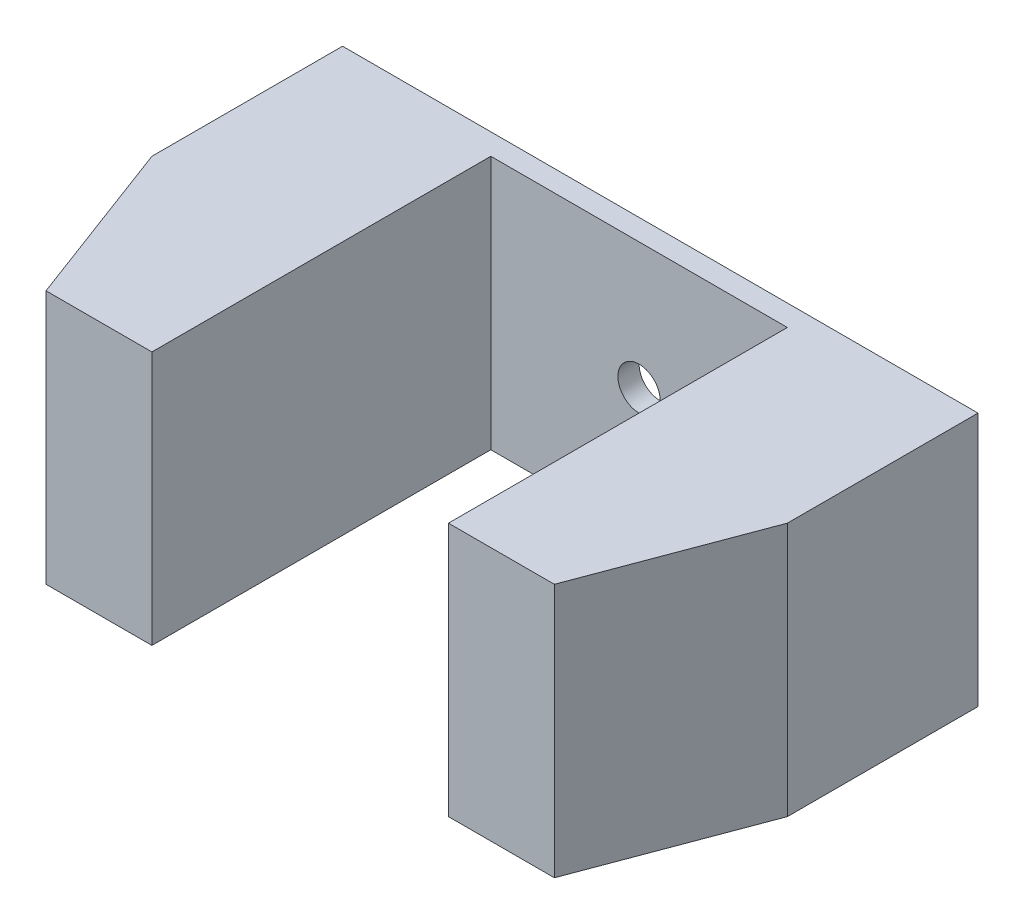
ISO-10303-21;
HEADER;
FILE_DESCRIPTION(('STEP AP214'),'2;1');
FILE_NAME('part.step','',(''),(''),'','','');
FILE_SCHEMA(('AUTOMOTIVE_DESIGN { 1 0 10303 214 1 1 1 1 }'));
ENDSEC;
DATA;
#1=APPLICATION_CONTEXT('core data for automotive mechanical design processes');
#2=APPLICATION_PROTOCOL_DEFINITION('international standard','automotive_design',2000,#1);
#3=PRODUCT_CONTEXT('',#1,'mechanical');
#4=PRODUCT('Part','Part','',(#3));
#5=PRODUCT_RELATED_PRODUCT_CATEGORY('part','',(#4));
#6=PRODUCT_DEFINITION_FORMATION('','',#4);
#7=PRODUCT_DEFINITION_CONTEXT('part definition',#1,'design');
#8=PRODUCT_DEFINITION('design','',#6,#7);
#9=PRODUCT_DEFINITION_SHAPE('','',#8);
#10=(LENGTH_UNIT() NAMED_UNIT(*) SI_UNIT(.MILLI.,.METRE.));
#11=(NAMED_UNIT(*) PLANE_ANGLE_UNIT() SI_UNIT($,.RADIAN.));
#12=(NAMED_UNIT(*) SI_UNIT($,.STERADIAN.) SOLID_ANGLE_UNIT());
#13=UNCERTAINTY_MEASURE_WITH_UNIT(LENGTH_MEASURE(1.E-05),#10,'distance_accuracy_value','');
#14=(GEOMETRIC_REPRESENTATION_CONTEXT(3) GLOBAL_UNCERTAINTY_ASSIGNED_CONTEXT((#13)) GLOBAL_UNIT_ASSIGNED_CONTEXT((#10,
#11,#12)) REPRESENTATION_CONTEXT('',''));
#15=CARTESIAN_POINT('',(0.,0.,0.));
#16=DIRECTION('',(0.,0.,1.));
#17=DIRECTION('',(1.,0.,0.));
#18=AXIS2_PLACEMENT_3D('',#15,#16,#17);
#19=CARTESIAN_POINT('',(0.,0.,5.));
#20=DIRECTION('',(0.,0.,-1.));
#21=DIRECTION('',(-1.,0.,0.));
#22=AXIS2_PLACEMENT_3D('',#19,#20,#21);
#23=PLANE('',#22);
#24=CARTESIAN_POINT('',(0.,0.,5.));
#25=DIRECTION('',(0.,0.,1.));
#26=DIRECTION('',(1.,0.,0.));
#27=AXIS2_PLACEMENT_3D('',#24,#25,#26);
#28=CIRCLE('',#27,5.);
#29=CARTESIAN_POINT('',(5.,0.,5.));
#30=VERTEX_POINT('',#29);
#31=EDGE_CURVE('E191',#30,#30,#28,.T.);
#32=ORIENTED_EDGE('',*,*,#31,.F.);
#33=EDGE_LOOP('',(#32));
#34=FACE_BOUND('',#33,.T.);
#35=DIRECTION('',(0.,1.,0.));
#36=VECTOR('',#35,1.);
#37=CARTESIAN_POINT('',(35.,-119.442719099992,5.));
#38=LINE('',#37,#36);
#39=CARTESIAN_POINT('',(35.,-30.,5.));
#40=VERTEX_POINT('',#39);
#41=CARTESIAN_POINT('',(35.,30.,5.));
#42=VERTEX_POINT('',#41);
#43=EDGE_CURVE('E158',#40,#42,#38,.T.);
#44=ORIENTED_EDGE('',*,*,#43,.T.);
#45=DIRECTION('',(1.,0.,0.));
#46=VECTOR('',#45,1.);
#47=CARTESIAN_POINT('',(-75.,30.,5.));
#48=LINE('',#47,#46);
#49=CARTESIAN_POINT('',(-35.,30.,5.));
#50=VERTEX_POINT('',#49);
#51=EDGE_CURVE('E197',#50,#42,#48,.T.);
#52=ORIENTED_EDGE('',*,*,#51,.F.);
#53=DIRECTION('',(0.,1.,0.));
#54=VECTOR('',#53,1.);
#55=CARTESIAN_POINT('',(-35.,-119.442719099992,5.));
#56=LINE('',#55,#54);
#57=CARTESIAN_POINT('',(-35.,-30.,5.));
#58=VERTEX_POINT('',#57);
#59=EDGE_CURVE('E65',#58,#50,#56,.T.);
#60=ORIENTED_EDGE('',*,*,#59,.F.);
#61=DIRECTION('',(1.,0.,0.));
#62=VECTOR('',#61,1.);
#63=CARTESIAN_POINT('',(-75.,-30.,5.));
#64=LINE('',#63,#62);
#65=EDGE_CURVE('E137',#58,#40,#64,.T.);
#66=ORIENTED_EDGE('',*,*,#65,.T.);
#67=EDGE_LOOP('',(#44,#52,#60,#66));
#68=FACE_BOUND('',#67,.T.);
#69=ADVANCED_FACE('F48',(#34,#68),#23,.F.);
#70=CARTESIAN_POINT('',(0.,0.,0.));
#71=DIRECTION('',(0.,0.,-1.));
#72=DIRECTION('',(-1.,0.,0.));
#73=AXIS2_PLACEMENT_3D('',#70,#71,#72);
#74=PLANE('',#73);
#75=DIRECTION('',(1.,0.,0.));
#76=VECTOR('',#75,1.);
#77=CARTESIAN_POINT('',(-75.,30.,0.));
#78=LINE('',#77,#76);
#79=CARTESIAN_POINT('',(-75.,30.,0.));
#80=VERTEX_POINT('',#79);
#81=CARTESIAN_POINT('',(75.,30.,0.));
#82=VERTEX_POINT('',#81);
#83=EDGE_CURVE('E194',#80,#82,#78,.T.);
#84=ORIENTED_EDGE('',*,*,#83,.T.);
#85=DIRECTION('',(0.,-1.,0.));
#86=VECTOR('',#85,1.);
#87=CARTESIAN_POINT('',(75.,30.,0.));
#88=LINE('',#87,#86);
#89=CARTESIAN_POINT('',(75.,-30.,0.));
#90=VERTEX_POINT('',#89);
#91=EDGE_CURVE('E131',#82,#90,#88,.T.);
#92=ORIENTED_EDGE('',*,*,#91,.T.);
#93=DIRECTION('',(1.,0.,0.));
#94=VECTOR('',#93,1.);
#95=CARTESIAN_POINT('',(-75.,-30.,0.));
#96=LINE('',#95,#94);
#97=CARTESIAN_POINT('',(-75.,-30.,0.));
#98=VERTEX_POINT('',#97);
#99=EDGE_CURVE('E204',#98,#90,#96,.T.);
#100=ORIENTED_EDGE('',*,*,#99,.F.);
#101=DIRECTION('',(0.,-1.,0.));
#102=VECTOR('',#101,1.);
#103=CARTESIAN_POINT('',(-75.,30.,0.));
#104=LINE('',#103,#102);
#105=EDGE_CURVE('E200',#80,#98,#104,.T.);
#106=ORIENTED_EDGE('',*,*,#105,.F.);
#107=EDGE_LOOP('',(#84,#92,#100,#106));
#108=FACE_BOUND('',#107,.T.);
#109=CARTESIAN_POINT('',(0.,0.,0.));
#110=DIRECTION('',(0.,0.,1.));
#111=DIRECTION('',(1.,0.,0.));
#112=AXIS2_PLACEMENT_3D('',#109,#110,#111);
#113=CIRCLE('',#112,5.);
#114=CARTESIAN_POINT('',(5.,0.,0.));
#115=VERTEX_POINT('',#114);
#116=EDGE_CURVE('E174',#115,#115,#113,.T.);
#117=ORIENTED_EDGE('',*,*,#116,.T.);
#118=EDGE_LOOP('',(#117));
#119=FACE_BOUND('',#118,.T.);
#120=ADVANCED_FACE('F213',(#108,#119),#74,.T.);
#121=CARTESIAN_POINT('',(-75.,30.,5.));
#122=DIRECTION('',(0.,1.,0.));
#123=DIRECTION('',(0.,0.,1.));
#124=AXIS2_PLACEMENT_3D('',#121,#122,#123);
#125=PLANE('',#124);
#126=ORIENTED_EDGE('',*,*,#83,.F.);
#127=DIRECTION('',(0.,0.,-1.));
#128=VECTOR('',#127,1.);
#129=CARTESIAN_POINT('',(-75.,30.,5.));
#130=LINE('',#129,#128);
#131=CARTESIAN_POINT('',(-75.,30.,45.));
#132=VERTEX_POINT('',#131);
#133=EDGE_CURVE('E12',#132,#80,#130,.T.);
#134=ORIENTED_EDGE('',*,*,#133,.F.);
#135=DIRECTION('',(0.351123441588391,0.,0.936329177569045));
#136=VECTOR('',#135,1.);
#137=CARTESIAN_POINT('',(-75.,30.,45.));
#138=LINE('',#137,#136);
#139=CARTESIAN_POINT('',(-60.,30.,85.));
#140=VERTEX_POINT('',#139);
#141=EDGE_CURVE('E181',#132,#140,#138,.T.);
#142=ORIENTED_EDGE('',*,*,#141,.T.);
#143=DIRECTION('',(1.,0.,0.));
#144=VECTOR('',#143,1.);
#145=CARTESIAN_POINT('',(-60.,30.,85.));
#146=LINE('',#145,#144);
#147=CARTESIAN_POINT('',(-35.,30.,85.));
#148=VERTEX_POINT('',#147);
#149=EDGE_CURVE('E178',#140,#148,#146,.T.);
#150=ORIENTED_EDGE('',*,*,#149,.T.);
#151=DIRECTION('',(0.,0.,-1.));
#152=VECTOR('',#151,1.);
#153=CARTESIAN_POINT('',(-35.,30.,85.));
#154=LINE('',#153,#152);
#155=EDGE_CURVE('E175',#148,#50,#154,.T.);
#156=ORIENTED_EDGE('',*,*,#155,.T.);
#157=ORIENTED_EDGE('',*,*,#51,.T.);
#158=DIRECTION('',(0.,0.,-1.));
#159=VECTOR('',#158,1.);
#160=CARTESIAN_POINT('',(35.,30.,85.));
#161=LINE('',#160,#159);
#162=CARTESIAN_POINT('',(35.,30.,85.));
#163=VERTEX_POINT('',#162);
#164=EDGE_CURVE('E152',#163,#42,#161,.T.);
#165=ORIENTED_EDGE('',*,*,#164,.F.);
#166=DIRECTION('',(-1.,0.,0.));
#167=VECTOR('',#166,1.);
#168=CARTESIAN_POINT('',(60.,30.,85.));
#169=LINE('',#168,#167);
#170=CARTESIAN_POINT('',(60.,30.,85.));
#171=VERTEX_POINT('',#170);
#172=EDGE_CURVE('E150',#171,#163,#169,.T.);
#173=ORIENTED_EDGE('',*,*,#172,.F.);
#174=DIRECTION('',(-0.351123441588391,0.,0.936329177569045));
#175=VECTOR('',#174,1.);
#176=CARTESIAN_POINT('',(75.,30.,45.));
#177=LINE('',#176,#175);
#178=CARTESIAN_POINT('',(75.,30.,45.));
#179=VERTEX_POINT('',#178);
#180=EDGE_CURVE('E142',#179,#171,#177,.T.);
#181=ORIENTED_EDGE('',*,*,#180,.F.);
#182=DIRECTION('',(0.,0.,-1.));
#183=VECTOR('',#182,1.);
#184=CARTESIAN_POINT('',(75.,30.,5.));
#185=LINE('',#184,#183);
#186=EDGE_CURVE('E52',#179,#82,#185,.T.);
#187=ORIENTED_EDGE('',*,*,#186,.T.);
#188=EDGE_LOOP('',(#126,#134,#142,#150,#156,#157,#165,#173,#181,#187));
#189=FACE_BOUND('',#188,.T.);
#190=ADVANCED_FACE('F50',(#189),#125,.T.);
#191=CARTESIAN_POINT('',(-75.,30.,5.));
#192=DIRECTION('',(1.,0.,0.));
#193=DIRECTION('',(0.,0.,-1.));
#194=AXIS2_PLACEMENT_3D('',#191,#192,#193);
#195=PLANE('',#194);
#196=ORIENTED_EDGE('',*,*,#105,.T.);
#197=DIRECTION('',(0.,0.,-1.));
#198=VECTOR('',#197,1.);
#199=CARTESIAN_POINT('',(-75.,-30.,5.));
#200=LINE('',#199,#198);
#201=CARTESIAN_POINT('',(-75.,-30.,45.));
#202=VERTEX_POINT('',#201);
#203=EDGE_CURVE('E57',#202,#98,#200,.T.);
#204=ORIENTED_EDGE('',*,*,#203,.F.);
#205=DIRECTION('',(0.,1.,0.));
#206=VECTOR('',#205,1.);
#207=CARTESIAN_POINT('',(-75.,-119.442719099992,45.));
#208=LINE('',#207,#206);
#209=EDGE_CURVE('E184',#202,#132,#208,.T.);
#210=ORIENTED_EDGE('',*,*,#209,.T.);
#211=ORIENTED_EDGE('',*,*,#133,.T.);
#212=EDGE_LOOP('',(#196,#204,#210,#211));
#213=FACE_BOUND('',#212,.T.);
#214=ADVANCED_FACE('F217',(#213),#195,.F.);
#215=CARTESIAN_POINT('',(-75.,-30.,5.));
#216=DIRECTION('',(0.,1.,0.));
#217=DIRECTION('',(0.,0.,1.));
#218=AXIS2_PLACEMENT_3D('',#215,#216,#217);
#219=PLANE('',#218);
#220=ORIENTED_EDGE('',*,*,#99,.T.);
#221=DIRECTION('',(0.,0.,-1.));
#222=VECTOR('',#221,1.);
#223=CARTESIAN_POINT('',(75.,-30.,5.));
#224=LINE('',#223,#222);
#225=CARTESIAN_POINT('',(75.,-30.,45.));
#226=VERTEX_POINT('',#225);
#227=EDGE_CURVE('E136',#226,#90,#224,.T.);
#228=ORIENTED_EDGE('',*,*,#227,.F.);
#229=DIRECTION('',(0.351123441588391,0.,-0.936329177569045));
#230=VECTOR('',#229,1.);
#231=CARTESIAN_POINT('',(75.,-30.,45.));
#232=LINE('',#231,#230);
#233=CARTESIAN_POINT('',(60.,-30.,85.));
#234=VERTEX_POINT('',#233);
#235=EDGE_CURVE('E144',#234,#226,#232,.T.);
#236=ORIENTED_EDGE('',*,*,#235,.F.);
#237=DIRECTION('',(1.,0.,0.));
#238=VECTOR('',#237,1.);
#239=CARTESIAN_POINT('',(60.,-30.,85.));
#240=LINE('',#239,#238);
#241=CARTESIAN_POINT('',(35.,-30.,85.));
#242=VERTEX_POINT('',#241);
#243=EDGE_CURVE('E166',#242,#234,#240,.T.);
#244=ORIENTED_EDGE('',*,*,#243,.F.);
#245=DIRECTION('',(0.,0.,1.));
#246=VECTOR('',#245,1.);
#247=CARTESIAN_POINT('',(35.,-30.,85.));
#248=LINE('',#247,#246);
#249=EDGE_CURVE('E145',#40,#242,#248,.T.);
#250=ORIENTED_EDGE('',*,*,#249,.F.);
#251=ORIENTED_EDGE('',*,*,#65,.F.);
#252=DIRECTION('',(0.,0.,1.));
#253=VECTOR('',#252,1.);
#254=CARTESIAN_POINT('',(-35.,-30.,85.));
#255=LINE('',#254,#253);
#256=CARTESIAN_POINT('',(-35.,-30.,85.));
#257=VERTEX_POINT('',#256);
#258=EDGE_CURVE('E172',#58,#257,#255,.T.);
#259=ORIENTED_EDGE('',*,*,#258,.T.);
#260=DIRECTION('',(-1.,0.,0.));
#261=VECTOR('',#260,1.);
#262=CARTESIAN_POINT('',(-60.,-30.,85.));
#263=LINE('',#262,#261);
#264=CARTESIAN_POINT('',(-60.,-30.,85.));
#265=VERTEX_POINT('',#264);
#266=EDGE_CURVE('E170',#257,#265,#263,.T.);
#267=ORIENTED_EDGE('',*,*,#266,.T.);
#268=DIRECTION('',(-0.351123441588391,0.,-0.936329177569045));
#269=VECTOR('',#268,1.);
#270=CARTESIAN_POINT('',(-75.,-30.,45.));
#271=LINE('',#270,#269);
#272=EDGE_CURVE('E167',#265,#202,#271,.T.);
#273=ORIENTED_EDGE('',*,*,#272,.T.);
#274=ORIENTED_EDGE('',*,*,#203,.T.);
#275=EDGE_LOOP('',(#220,#228,#236,#244,#250,#251,#259,#267,#273,#274));
#276=FACE_BOUND('',#275,.T.);
#277=ADVANCED_FACE('F211',(#276),#219,.F.);
#278=CARTESIAN_POINT('',(75.,30.,5.));
#279=DIRECTION('',(1.,0.,0.));
#280=DIRECTION('',(0.,0.,-1.));
#281=AXIS2_PLACEMENT_3D('',#278,#279,#280);
#282=PLANE('',#281);
#283=ORIENTED_EDGE('',*,*,#91,.F.);
#284=ORIENTED_EDGE('',*,*,#186,.F.);
#285=DIRECTION('',(0.,1.,0.));
#286=VECTOR('',#285,1.);
#287=CARTESIAN_POINT('',(75.,-119.442719099992,45.));
#288=LINE('',#287,#286);
#289=EDGE_CURVE('E128',#226,#179,#288,.T.);
#290=ORIENTED_EDGE('',*,*,#289,.F.);
#291=ORIENTED_EDGE('',*,*,#227,.T.);
#292=EDGE_LOOP('',(#283,#284,#290,#291));
#293=FACE_BOUND('',#292,.T.);
#294=ADVANCED_FACE('F127',(#293),#282,.T.);
#295=CARTESIAN_POINT('',(0.,0.,5.));
#296=DIRECTION('',(0.,0.,-1.));
#297=DIRECTION('',(-1.,0.,0.));
#298=AXIS2_PLACEMENT_3D('',#295,#296,#297);
#299=CYLINDRICAL_SURFACE('',#298,5.);
#300=ORIENTED_EDGE('',*,*,#31,.T.);
#301=EDGE_LOOP('',(#300));
#302=FACE_BOUND('',#301,.T.);
#303=ORIENTED_EDGE('',*,*,#116,.F.);
#304=EDGE_LOOP('',(#303));
#305=FACE_BOUND('',#304,.T.);
#306=ADVANCED_FACE('F255',(#302,#305),#299,.F.);
#307=CARTESIAN_POINT('',(-35.,-119.442719099992,85.));
#308=DIRECTION('',(1.,0.,0.));
#309=DIRECTION('',(0.,0.,-1.));
#310=AXIS2_PLACEMENT_3D('',#307,#308,#309);
#311=PLANE('',#310);
#312=ORIENTED_EDGE('',*,*,#258,.F.);
#313=ORIENTED_EDGE('',*,*,#59,.T.);
#314=ORIENTED_EDGE('',*,*,#155,.F.);
#315=DIRECTION('',(0.,1.,0.));
#316=VECTOR('',#315,1.);
#317=CARTESIAN_POINT('',(-35.,-119.442719099992,85.));
#318=LINE('',#317,#316);
#319=EDGE_CURVE('E188',#257,#148,#318,.T.);
#320=ORIENTED_EDGE('',*,*,#319,.F.);
#321=EDGE_LOOP('',(#312,#313,#314,#320));
#322=FACE_BOUND('',#321,.T.);
#323=ADVANCED_FACE('F230',(#322),#311,.T.);
#324=CARTESIAN_POINT('',(-60.,-119.442719099992,85.));
#325=DIRECTION('',(0.,0.,1.));
#326=DIRECTION('',(1.,0.,0.));
#327=AXIS2_PLACEMENT_3D('',#324,#325,#326);
#328=PLANE('',#327);
#329=ORIENTED_EDGE('',*,*,#266,.F.);
#330=ORIENTED_EDGE('',*,*,#319,.T.);
#331=ORIENTED_EDGE('',*,*,#149,.F.);
#332=DIRECTION('',(0.,1.,0.));
#333=VECTOR('',#332,1.);
#334=CARTESIAN_POINT('',(-60.,-119.442719099992,85.));
#335=LINE('',#334,#333);
#336=EDGE_CURVE('E186',#265,#140,#335,.T.);
#337=ORIENTED_EDGE('',*,*,#336,.F.);
#338=EDGE_LOOP('',(#329,#330,#331,#337));
#339=FACE_BOUND('',#338,.T.);
#340=ADVANCED_FACE('F225',(#339),#328,.T.);
#341=CARTESIAN_POINT('',(-75.,-119.442719099992,45.));
#342=DIRECTION('',(-0.936329177569045,0.,0.351123441588391));
#343=DIRECTION('',(0.351123441588391,0.,0.936329177569045));
#344=AXIS2_PLACEMENT_3D('',#341,#342,#343);
#345=PLANE('',#344);
#346=ORIENTED_EDGE('',*,*,#272,.F.);
#347=ORIENTED_EDGE('',*,*,#336,.T.);
#348=ORIENTED_EDGE('',*,*,#141,.F.);
#349=ORIENTED_EDGE('',*,*,#209,.F.);
#350=EDGE_LOOP('',(#346,#347,#348,#349));
#351=FACE_BOUND('',#350,.T.);
#352=ADVANCED_FACE('F220',(#351),#345,.T.);
#353=CARTESIAN_POINT('',(35.,-119.442719099992,85.));
#354=DIRECTION('',(1.,0.,0.));
#355=DIRECTION('',(0.,0.,-1.));
#356=AXIS2_PLACEMENT_3D('',#353,#354,#355);
#357=PLANE('',#356);
#358=ORIENTED_EDGE('',*,*,#43,.F.);
#359=ORIENTED_EDGE('',*,*,#249,.T.);
#360=DIRECTION('',(0.,1.,0.));
#361=VECTOR('',#360,1.);
#362=CARTESIAN_POINT('',(35.,-119.442719099992,85.));
#363=LINE('',#362,#361);
#364=EDGE_CURVE('E161',#242,#163,#363,.T.);
#365=ORIENTED_EDGE('',*,*,#364,.T.);
#366=ORIENTED_EDGE('',*,*,#164,.T.);
#367=EDGE_LOOP('',(#358,#359,#365,#366));
#368=FACE_BOUND('',#367,.T.);
#369=ADVANCED_FACE('F233',(#368),#357,.F.);
#370=CARTESIAN_POINT('',(60.,-119.442719099992,85.));
#371=DIRECTION('',(0.,0.,-1.));
#372=DIRECTION('',(-1.,0.,0.));
#373=AXIS2_PLACEMENT_3D('',#370,#371,#372);
#374=PLANE('',#373);
#375=ORIENTED_EDGE('',*,*,#364,.F.);
#376=ORIENTED_EDGE('',*,*,#243,.T.);
#377=DIRECTION('',(0.,1.,0.));
#378=VECTOR('',#377,1.);
#379=CARTESIAN_POINT('',(60.,-119.442719099992,85.));
#380=LINE('',#379,#378);
#381=EDGE_CURVE('E146',#234,#171,#380,.T.);
#382=ORIENTED_EDGE('',*,*,#381,.T.);
#383=ORIENTED_EDGE('',*,*,#172,.T.);
#384=EDGE_LOOP('',(#375,#376,#382,#383));
#385=FACE_BOUND('',#384,.T.);
#386=ADVANCED_FACE('F237',(#385),#374,.F.);
#387=CARTESIAN_POINT('',(75.,-119.442719099992,45.));
#388=DIRECTION('',(-0.936329177569045,0.,-0.351123441588391));
#389=DIRECTION('',(-0.351123441588391,0.,0.936329177569045));
#390=AXIS2_PLACEMENT_3D('',#387,#388,#389);
#391=PLANE('',#390);
#392=ORIENTED_EDGE('',*,*,#381,.F.);
#393=ORIENTED_EDGE('',*,*,#235,.T.);
#394=ORIENTED_EDGE('',*,*,#289,.T.);
#395=ORIENTED_EDGE('',*,*,#180,.T.);
#396=EDGE_LOOP('',(#392,#393,#394,#395));
#397=FACE_BOUND('',#396,.T.);
#398=ADVANCED_FACE('F141',(#397),#391,.F.);
#399=CLOSED_SHELL('',(#69,#120,#190,#214,#277,#294,#306,#323,#340,#352,#369,#386,#398));
#400=MANIFOLD_SOLID_BREP('B2',#399);
#401=ADVANCED_BREP_SHAPE_REPRESENTATION('',(#18,#400),#14);
#402=SHAPE_DEFINITION_REPRESENTATION(#9,#401);
ENDSEC;
END-ISO-10303-21;
